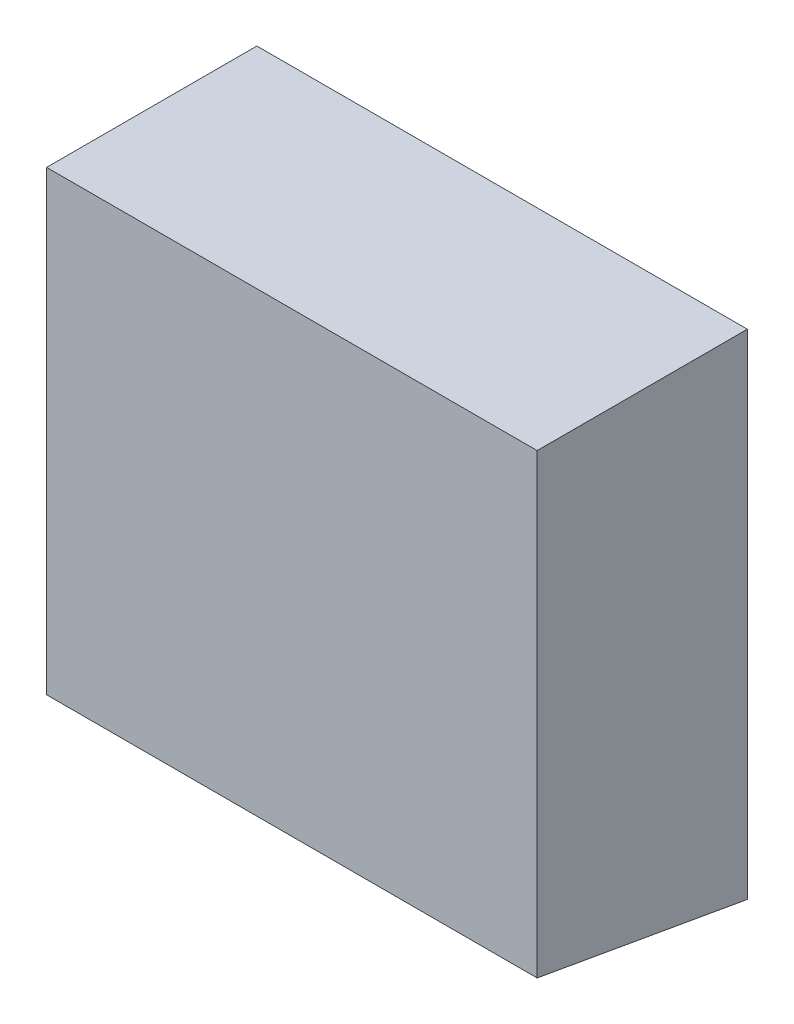
ISO-10303-21;
HEADER;
FILE_DESCRIPTION(('STEP AP214'),'2;1');
FILE_NAME('part.step','',(''),(''),'','','');
FILE_SCHEMA(('AUTOMOTIVE_DESIGN { 1 0 10303 214 1 1 1 1 }'));
ENDSEC;
DATA;
#1=APPLICATION_CONTEXT('core data for automotive mechanical design processes');
#2=APPLICATION_PROTOCOL_DEFINITION('international standard','automotive_design',2000,#1);
#3=PRODUCT_CONTEXT('',#1,'mechanical');
#4=PRODUCT('Part','Part','',(#3));
#5=PRODUCT_RELATED_PRODUCT_CATEGORY('part','',(#4));
#6=PRODUCT_DEFINITION_FORMATION('','',#4);
#7=PRODUCT_DEFINITION_CONTEXT('part definition',#1,'design');
#8=PRODUCT_DEFINITION('design','',#6,#7);
#9=PRODUCT_DEFINITION_SHAPE('','',#8);
#10=(LENGTH_UNIT() NAMED_UNIT(*) SI_UNIT(.MILLI.,.METRE.));
#11=(NAMED_UNIT(*) PLANE_ANGLE_UNIT() SI_UNIT($,.RADIAN.));
#12=(NAMED_UNIT(*) SI_UNIT($,.STERADIAN.) SOLID_ANGLE_UNIT());
#13=UNCERTAINTY_MEASURE_WITH_UNIT(LENGTH_MEASURE(1.E-05),#10,'distance_accuracy_value','');
#14=(GEOMETRIC_REPRESENTATION_CONTEXT(3) GLOBAL_UNCERTAINTY_ASSIGNED_CONTEXT((#13)) GLOBAL_UNIT_ASSIGNED_CONTEXT((#10,
#11,#12)) REPRESENTATION_CONTEXT('',''));
#15=CARTESIAN_POINT('',(0.,0.,0.));
#16=DIRECTION('',(0.,0.,1.));
#17=DIRECTION('',(1.,0.,0.));
#18=AXIS2_PLACEMENT_3D('',#15,#16,#17);
#19=CARTESIAN_POINT('',(-44.45,89.5,-19.05));
#20=DIRECTION('',(1.,0.,0.));
#21=DIRECTION('',(0.,0.,-1.));
#22=AXIS2_PLACEMENT_3D('',#19,#20,#21);
#23=PLANE('',#22);
#24=DIRECTION('',(0.,-1.,0.));
#25=VECTOR('',#24,1.);
#26=CARTESIAN_POINT('',(-44.45,89.5,-19.05));
#27=LINE('',#26,#25);
#28=CARTESIAN_POINT('',(-44.45,89.5,-19.05));
#29=VERTEX_POINT('',#28);
#30=CARTESIAN_POINT('',(-44.45,0.,-19.05));
#31=VERTEX_POINT('',#30);
#32=EDGE_CURVE('E91',#29,#31,#27,.T.);
#33=ORIENTED_EDGE('',*,*,#32,.T.);
#34=DIRECTION('',(0.,-0.173648177666924,-0.984807753012209));
#35=VECTOR('',#34,1.);
#36=CARTESIAN_POINT('',(-44.45,0.,-19.05));
#37=LINE('',#36,#35);
#38=CARTESIAN_POINT('',(-44.45,6.71805796499225,19.05));
#39=VERTEX_POINT('',#38);
#40=EDGE_CURVE('E78',#39,#31,#37,.T.);
#41=ORIENTED_EDGE('',*,*,#40,.F.);
#42=DIRECTION('',(0.,-1.,0.));
#43=VECTOR('',#42,1.);
#44=CARTESIAN_POINT('',(-44.45,89.5,19.05));
#45=LINE('',#44,#43);
#46=CARTESIAN_POINT('',(-44.45,89.5,19.05));
#47=VERTEX_POINT('',#46);
#48=EDGE_CURVE('E11',#47,#39,#45,.T.);
#49=ORIENTED_EDGE('',*,*,#48,.F.);
#50=DIRECTION('',(0.,0.,1.));
#51=VECTOR('',#50,1.);
#52=CARTESIAN_POINT('',(-44.45,89.5,-19.05));
#53=LINE('',#52,#51);
#54=EDGE_CURVE('E97',#29,#47,#53,.T.);
#55=ORIENTED_EDGE('',*,*,#54,.F.);
#56=EDGE_LOOP('',(#33,#41,#49,#55));
#57=FACE_BOUND('',#56,.T.);
#58=ADVANCED_FACE('F39',(#57),#23,.F.);
#59=CARTESIAN_POINT('',(-44.45,89.5,19.05));
#60=DIRECTION('',(0.,0.,-1.));
#61=DIRECTION('',(-1.,0.,0.));
#62=AXIS2_PLACEMENT_3D('',#59,#60,#61);
#63=PLANE('',#62);
#64=ORIENTED_EDGE('',*,*,#48,.T.);
#65=DIRECTION('',(-1.,0.,0.));
#66=VECTOR('',#65,1.);
#67=CARTESIAN_POINT('',(44.451,6.71805796499225,19.05));
#68=LINE('',#67,#66);
#69=CARTESIAN_POINT('',(44.45,6.71805796499225,19.05));
#70=VERTEX_POINT('',#69);
#71=EDGE_CURVE('E75',#70,#39,#68,.T.);
#72=ORIENTED_EDGE('',*,*,#71,.F.);
#73=DIRECTION('',(0.,-1.,0.));
#74=VECTOR('',#73,1.);
#75=CARTESIAN_POINT('',(44.45,89.5,19.05));
#76=LINE('',#75,#74);
#77=CARTESIAN_POINT('',(44.45,89.5,19.05));
#78=VERTEX_POINT('',#77);
#79=EDGE_CURVE('E47',#78,#70,#76,.T.);
#80=ORIENTED_EDGE('',*,*,#79,.F.);
#81=DIRECTION('',(1.,0.,0.));
#82=VECTOR('',#81,1.);
#83=CARTESIAN_POINT('',(-44.45,89.5,19.05));
#84=LINE('',#83,#82);
#85=EDGE_CURVE('E94',#47,#78,#84,.T.);
#86=ORIENTED_EDGE('',*,*,#85,.F.);
#87=EDGE_LOOP('',(#64,#72,#80,#86));
#88=FACE_BOUND('',#87,.T.);
#89=ADVANCED_FACE('F93',(#88),#63,.F.);
#90=CARTESIAN_POINT('',(44.45,89.5,-19.05));
#91=DIRECTION('',(-1.,0.,0.));
#92=DIRECTION('',(0.,0.,1.));
#93=AXIS2_PLACEMENT_3D('',#90,#91,#92);
#94=PLANE('',#93);
#95=ORIENTED_EDGE('',*,*,#79,.T.);
#96=DIRECTION('',(0.,0.173648177666924,0.984807753012209));
#97=VECTOR('',#96,1.);
#98=CARTESIAN_POINT('',(44.45,0.,-19.05));
#99=LINE('',#98,#97);
#100=CARTESIAN_POINT('',(44.45,0.,-19.05));
#101=VERTEX_POINT('',#100);
#102=EDGE_CURVE('E81',#101,#70,#99,.T.);
#103=ORIENTED_EDGE('',*,*,#102,.F.);
#104=DIRECTION('',(0.,-1.,0.));
#105=VECTOR('',#104,1.);
#106=CARTESIAN_POINT('',(44.45,89.5,-19.05));
#107=LINE('',#106,#105);
#108=CARTESIAN_POINT('',(44.45,89.5,-19.05));
#109=VERTEX_POINT('',#108);
#110=EDGE_CURVE('E106',#109,#101,#107,.T.);
#111=ORIENTED_EDGE('',*,*,#110,.F.);
#112=DIRECTION('',(0.,0.,-1.));
#113=VECTOR('',#112,1.);
#114=CARTESIAN_POINT('',(44.45,89.5,-19.05));
#115=LINE('',#114,#113);
#116=EDGE_CURVE('E96',#78,#109,#115,.T.);
#117=ORIENTED_EDGE('',*,*,#116,.F.);
#118=EDGE_LOOP('',(#95,#103,#111,#117));
#119=FACE_BOUND('',#118,.T.);
#120=ADVANCED_FACE('F109',(#119),#94,.F.);
#121=CARTESIAN_POINT('',(-44.45,89.5,-19.05));
#122=DIRECTION('',(0.,0.,1.));
#123=DIRECTION('',(1.,0.,0.));
#124=AXIS2_PLACEMENT_3D('',#121,#122,#123);
#125=PLANE('',#124);
#126=DIRECTION('',(-1.,0.,0.));
#127=VECTOR('',#126,1.);
#128=CARTESIAN_POINT('',(-44.45,0.,-19.05));
#129=LINE('',#128,#127);
#130=EDGE_CURVE('E85',#101,#31,#129,.T.);
#131=ORIENTED_EDGE('',*,*,#130,.T.);
#132=ORIENTED_EDGE('',*,*,#32,.F.);
#133=DIRECTION('',(-1.,0.,0.));
#134=VECTOR('',#133,1.);
#135=CARTESIAN_POINT('',(-44.45,89.5,-19.05));
#136=LINE('',#135,#134);
#137=EDGE_CURVE('E54',#109,#29,#136,.T.);
#138=ORIENTED_EDGE('',*,*,#137,.F.);
#139=ORIENTED_EDGE('',*,*,#110,.T.);
#140=EDGE_LOOP('',(#131,#132,#138,#139));
#141=FACE_BOUND('',#140,.T.);
#142=ADVANCED_FACE('F112',(#141),#125,.F.);
#143=CARTESIAN_POINT('',(0.,89.5,0.));
#144=DIRECTION('',(0.,1.,0.));
#145=DIRECTION('',(0.,0.,1.));
#146=AXIS2_PLACEMENT_3D('',#143,#144,#145);
#147=PLANE('',#146);
#148=ORIENTED_EDGE('',*,*,#54,.T.);
#149=ORIENTED_EDGE('',*,*,#85,.T.);
#150=ORIENTED_EDGE('',*,*,#116,.T.);
#151=ORIENTED_EDGE('',*,*,#137,.T.);
#152=EDGE_LOOP('',(#148,#149,#150,#151));
#153=FACE_BOUND('',#152,.T.);
#154=ADVANCED_FACE('F99',(#153),#147,.T.);
#155=CARTESIAN_POINT('',(44.451,0.,-19.05));
#156=DIRECTION('',(0.,0.984807753012209,-0.173648177666924));
#157=DIRECTION('',(0.,0.173648177666924,0.984807753012209));
#158=AXIS2_PLACEMENT_3D('',#155,#156,#157);
#159=PLANE('',#158);
#160=ORIENTED_EDGE('',*,*,#102,.T.);
#161=ORIENTED_EDGE('',*,*,#71,.T.);
#162=ORIENTED_EDGE('',*,*,#40,.T.);
#163=ORIENTED_EDGE('',*,*,#130,.F.);
#164=EDGE_LOOP('',(#160,#161,#162,#163));
#165=FACE_BOUND('',#164,.T.);
#166=ADVANCED_FACE('F77',(#165),#159,.F.);
#167=CLOSED_SHELL('',(#58,#89,#120,#142,#154,#166));
#168=MANIFOLD_SOLID_BREP('B2',#167);
#169=ADVANCED_BREP_SHAPE_REPRESENTATION('',(#18,#168),#14);
#170=SHAPE_DEFINITION_REPRESENTATION(#9,#169);
ENDSEC;
END-ISO-10303-21;
